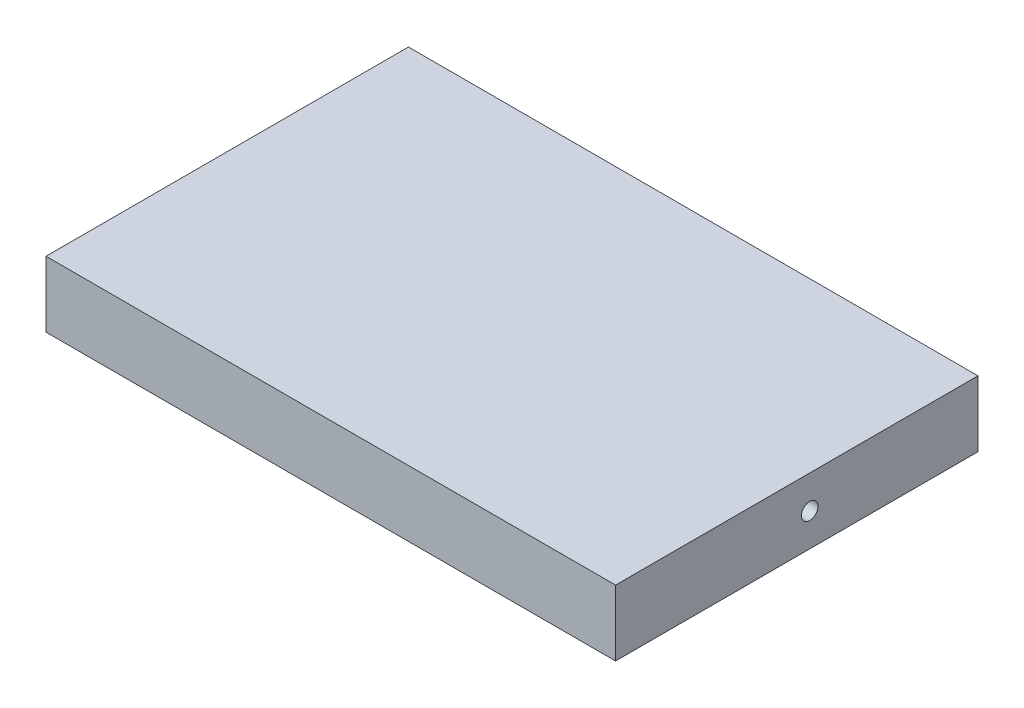
ISO-10303-21;
HEADER;
FILE_DESCRIPTION(('STEP AP214'),'2;1');
FILE_NAME('part.step','',(''),(''),'','','');
FILE_SCHEMA(('AUTOMOTIVE_DESIGN { 1 0 10303 214 1 1 1 1 }'));
ENDSEC;
DATA;
#1=APPLICATION_CONTEXT('core data for automotive mechanical design processes');
#2=APPLICATION_PROTOCOL_DEFINITION('international standard','automotive_design',2000,#1);
#3=PRODUCT_CONTEXT('',#1,'mechanical');
#4=PRODUCT('Part','Part','',(#3));
#5=PRODUCT_RELATED_PRODUCT_CATEGORY('part','',(#4));
#6=PRODUCT_DEFINITION_FORMATION('','',#4);
#7=PRODUCT_DEFINITION_CONTEXT('part definition',#1,'design');
#8=PRODUCT_DEFINITION('design','',#6,#7);
#9=PRODUCT_DEFINITION_SHAPE('','',#8);
#10=(LENGTH_UNIT() NAMED_UNIT(*) SI_UNIT(.MILLI.,.METRE.));
#11=(NAMED_UNIT(*) PLANE_ANGLE_UNIT() SI_UNIT($,.RADIAN.));
#12=(NAMED_UNIT(*) SI_UNIT($,.STERADIAN.) SOLID_ANGLE_UNIT());
#13=UNCERTAINTY_MEASURE_WITH_UNIT(LENGTH_MEASURE(1.E-05),#10,'distance_accuracy_value','');
#14=(GEOMETRIC_REPRESENTATION_CONTEXT(3) GLOBAL_UNCERTAINTY_ASSIGNED_CONTEXT((#13)) GLOBAL_UNIT_ASSIGNED_CONTEXT((#10,
#11,#12)) REPRESENTATION_CONTEXT('',''));
#15=CARTESIAN_POINT('',(0.,0.,0.));
#16=DIRECTION('',(0.,0.,1.));
#17=DIRECTION('',(1.,0.,0.));
#18=AXIS2_PLACEMENT_3D('',#15,#16,#17);
#19=CARTESIAN_POINT('',(110.,25.4,-70.));
#20=DIRECTION('',(-1.,0.,0.));
#21=DIRECTION('',(0.,0.,1.));
#22=AXIS2_PLACEMENT_3D('',#19,#20,#21);
#23=PLANE('',#22);
#24=CARTESIAN_POINT('',(110.,12.7,-5.));
#25=DIRECTION('',(1.,0.,0.));
#26=DIRECTION('',(0.,0.,-1.));
#27=AXIS2_PLACEMENT_3D('',#24,#25,#26);
#28=CIRCLE('',#27,3.2);
#29=CARTESIAN_POINT('',(110.,12.7,-8.2));
#30=VERTEX_POINT('',#29);
#31=EDGE_CURVE('E116',#30,#30,#28,.T.);
#32=ORIENTED_EDGE('',*,*,#31,.F.);
#33=EDGE_LOOP('',(#32));
#34=FACE_BOUND('',#33,.T.);
#35=DIRECTION('',(0.,0.,-1.));
#36=VECTOR('',#35,1.);
#37=CARTESIAN_POINT('',(110.,0.,-70.));
#38=LINE('',#37,#36);
#39=CARTESIAN_POINT('',(110.,0.,70.));
#40=VERTEX_POINT('',#39);
#41=CARTESIAN_POINT('',(110.,0.,-70.));
#42=VERTEX_POINT('',#41);
#43=EDGE_CURVE('E96',#40,#42,#38,.T.);
#44=ORIENTED_EDGE('',*,*,#43,.T.);
#45=DIRECTION('',(0.,-1.,0.));
#46=VECTOR('',#45,1.);
#47=CARTESIAN_POINT('',(110.,25.4,-70.));
#48=LINE('',#47,#46);
#49=CARTESIAN_POINT('',(110.,25.4,-70.));
#50=VERTEX_POINT('',#49);
#51=EDGE_CURVE('E11',#50,#42,#48,.T.);
#52=ORIENTED_EDGE('',*,*,#51,.F.);
#53=DIRECTION('',(0.,0.,-1.));
#54=VECTOR('',#53,1.);
#55=CARTESIAN_POINT('',(110.,25.4,-70.));
#56=LINE('',#55,#54);
#57=CARTESIAN_POINT('',(110.,25.4,70.));
#58=VERTEX_POINT('',#57);
#59=EDGE_CURVE('E84',#58,#50,#56,.T.);
#60=ORIENTED_EDGE('',*,*,#59,.F.);
#61=DIRECTION('',(0.,-1.,0.));
#62=VECTOR('',#61,1.);
#63=CARTESIAN_POINT('',(110.,25.4,70.));
#64=LINE('',#63,#62);
#65=EDGE_CURVE('E92',#58,#40,#64,.T.);
#66=ORIENTED_EDGE('',*,*,#65,.T.);
#67=EDGE_LOOP('',(#44,#52,#60,#66));
#68=FACE_BOUND('',#67,.T.);
#69=ADVANCED_FACE('F33',(#34,#68),#23,.F.);
#70=CARTESIAN_POINT('',(-110.,25.4,-70.));
#71=DIRECTION('',(0.,0.,1.));
#72=DIRECTION('',(1.,0.,0.));
#73=AXIS2_PLACEMENT_3D('',#70,#71,#72);
#74=PLANE('',#73);
#75=DIRECTION('',(-1.,0.,0.));
#76=VECTOR('',#75,1.);
#77=CARTESIAN_POINT('',(-110.,0.,-70.));
#78=LINE('',#77,#76);
#79=CARTESIAN_POINT('',(-110.,0.,-70.));
#80=VERTEX_POINT('',#79);
#81=EDGE_CURVE('E88',#42,#80,#78,.T.);
#82=ORIENTED_EDGE('',*,*,#81,.T.);
#83=DIRECTION('',(0.,-1.,0.));
#84=VECTOR('',#83,1.);
#85=CARTESIAN_POINT('',(-110.,25.4,-70.));
#86=LINE('',#85,#84);
#87=CARTESIAN_POINT('',(-110.,25.4,-70.));
#88=VERTEX_POINT('',#87);
#89=EDGE_CURVE('E41',#88,#80,#86,.T.);
#90=ORIENTED_EDGE('',*,*,#89,.F.);
#91=DIRECTION('',(-1.,0.,0.));
#92=VECTOR('',#91,1.);
#93=CARTESIAN_POINT('',(-110.,25.4,-70.));
#94=LINE('',#93,#92);
#95=EDGE_CURVE('E79',#50,#88,#94,.T.);
#96=ORIENTED_EDGE('',*,*,#95,.F.);
#97=ORIENTED_EDGE('',*,*,#51,.T.);
#98=EDGE_LOOP('',(#82,#90,#96,#97));
#99=FACE_BOUND('',#98,.T.);
#100=ADVANCED_FACE('F87',(#99),#74,.F.);
#101=CARTESIAN_POINT('',(-110.,25.4,-70.));
#102=DIRECTION('',(1.,0.,0.));
#103=DIRECTION('',(0.,0.,-1.));
#104=AXIS2_PLACEMENT_3D('',#101,#102,#103);
#105=PLANE('',#104);
#106=CARTESIAN_POINT('',(-110.,12.7,-4.99999999999998));
#107=DIRECTION('',(-1.,0.,0.));
#108=DIRECTION('',(0.,0.,1.));
#109=AXIS2_PLACEMENT_3D('',#106,#107,#108);
#110=CIRCLE('',#109,3.2);
#111=CARTESIAN_POINT('',(-110.,12.7,-1.79999999999998));
#112=VERTEX_POINT('',#111);
#113=EDGE_CURVE('E110',#112,#112,#110,.T.);
#114=ORIENTED_EDGE('',*,*,#113,.F.);
#115=EDGE_LOOP('',(#114));
#116=FACE_BOUND('',#115,.T.);
#117=DIRECTION('',(0.,0.,1.));
#118=VECTOR('',#117,1.);
#119=CARTESIAN_POINT('',(-110.,0.,-70.));
#120=LINE('',#119,#118);
#121=CARTESIAN_POINT('',(-110.,0.,70.));
#122=VERTEX_POINT('',#121);
#123=EDGE_CURVE('E66',#80,#122,#120,.T.);
#124=ORIENTED_EDGE('',*,*,#123,.T.);
#125=DIRECTION('',(0.,-1.,0.));
#126=VECTOR('',#125,1.);
#127=CARTESIAN_POINT('',(-110.,25.4,70.));
#128=LINE('',#127,#126);
#129=CARTESIAN_POINT('',(-110.,25.4,70.));
#130=VERTEX_POINT('',#129);
#131=EDGE_CURVE('E89',#130,#122,#128,.T.);
#132=ORIENTED_EDGE('',*,*,#131,.F.);
#133=DIRECTION('',(0.,0.,1.));
#134=VECTOR('',#133,1.);
#135=CARTESIAN_POINT('',(-110.,25.4,-70.));
#136=LINE('',#135,#134);
#137=EDGE_CURVE('E82',#88,#130,#136,.T.);
#138=ORIENTED_EDGE('',*,*,#137,.F.);
#139=ORIENTED_EDGE('',*,*,#89,.T.);
#140=EDGE_LOOP('',(#124,#132,#138,#139));
#141=FACE_BOUND('',#140,.T.);
#142=ADVANCED_FACE('F90',(#116,#141),#105,.F.);
#143=CARTESIAN_POINT('',(-110.,25.4,70.));
#144=DIRECTION('',(0.,0.,-1.));
#145=DIRECTION('',(-1.,0.,0.));
#146=AXIS2_PLACEMENT_3D('',#143,#144,#145);
#147=PLANE('',#146);
#148=DIRECTION('',(1.,0.,0.));
#149=VECTOR('',#148,1.);
#150=CARTESIAN_POINT('',(-110.,0.,70.));
#151=LINE('',#150,#149);
#152=EDGE_CURVE('E72',#122,#40,#151,.T.);
#153=ORIENTED_EDGE('',*,*,#152,.T.);
#154=ORIENTED_EDGE('',*,*,#65,.F.);
#155=DIRECTION('',(1.,0.,0.));
#156=VECTOR('',#155,1.);
#157=CARTESIAN_POINT('',(-110.,25.4,70.));
#158=LINE('',#157,#156);
#159=EDGE_CURVE('E49',#130,#58,#158,.T.);
#160=ORIENTED_EDGE('',*,*,#159,.F.);
#161=ORIENTED_EDGE('',*,*,#131,.T.);
#162=EDGE_LOOP('',(#153,#154,#160,#161));
#163=FACE_BOUND('',#162,.T.);
#164=ADVANCED_FACE('F104',(#163),#147,.F.);
#165=CARTESIAN_POINT('',(0.,25.4,0.));
#166=DIRECTION('',(0.,1.,0.));
#167=DIRECTION('',(0.,0.,1.));
#168=AXIS2_PLACEMENT_3D('',#165,#166,#167);
#169=PLANE('',#168);
#170=ORIENTED_EDGE('',*,*,#59,.T.);
#171=ORIENTED_EDGE('',*,*,#95,.T.);
#172=ORIENTED_EDGE('',*,*,#137,.T.);
#173=ORIENTED_EDGE('',*,*,#159,.T.);
#174=EDGE_LOOP('',(#170,#171,#172,#173));
#175=FACE_BOUND('',#174,.T.);
#176=ADVANCED_FACE('F80',(#175),#169,.T.);
#177=CARTESIAN_POINT('',(0.,0.,0.));
#178=DIRECTION('',(0.,1.,0.));
#179=DIRECTION('',(0.,0.,1.));
#180=AXIS2_PLACEMENT_3D('',#177,#178,#179);
#181=PLANE('',#180);
#182=ORIENTED_EDGE('',*,*,#43,.F.);
#183=ORIENTED_EDGE('',*,*,#152,.F.);
#184=ORIENTED_EDGE('',*,*,#123,.F.);
#185=ORIENTED_EDGE('',*,*,#81,.F.);
#186=EDGE_LOOP('',(#182,#183,#184,#185));
#187=FACE_BOUND('',#186,.T.);
#188=ADVANCED_FACE('F107',(#187),#181,.F.);
#189=CARTESIAN_POINT('',(-90.,12.7,-4.99999999999999));
#190=DIRECTION('',(-1.,0.,0.));
#191=DIRECTION('',(0.,0.,1.));
#192=AXIS2_PLACEMENT_3D('',#189,#190,#191);
#193=CYLINDRICAL_SURFACE('',#192,3.2);
#194=CARTESIAN_POINT('',(-90.,12.7,-4.99999999999999));
#195=DIRECTION('',(-1.,0.,0.));
#196=DIRECTION('',(0.,0.,1.));
#197=AXIS2_PLACEMENT_3D('',#194,#195,#196);
#198=CIRCLE('',#197,3.2);
#199=CARTESIAN_POINT('',(-90.,12.7,-1.79999999999999));
#200=VERTEX_POINT('',#199);
#201=EDGE_CURVE('E99',#200,#200,#198,.T.);
#202=ORIENTED_EDGE('',*,*,#201,.F.);
#203=EDGE_LOOP('',(#202));
#204=FACE_BOUND('',#203,.T.);
#205=ORIENTED_EDGE('',*,*,#113,.T.);
#206=EDGE_LOOP('',(#205));
#207=FACE_BOUND('',#206,.T.);
#208=ADVANCED_FACE('F145',(#204,#207),#193,.F.);
#209=CARTESIAN_POINT('',(-90.,12.7,-4.99999999999999));
#210=DIRECTION('',(-1.,0.,0.));
#211=DIRECTION('',(0.,0.,1.));
#212=AXIS2_PLACEMENT_3D('',#209,#210,#211);
#213=PLANE('',#212);
#214=ORIENTED_EDGE('',*,*,#201,.T.);
#215=EDGE_LOOP('',(#214));
#216=FACE_BOUND('',#215,.T.);
#217=ADVANCED_FACE('F127',(#216),#213,.T.);
#218=CARTESIAN_POINT('',(90.,12.7,-4.99999999999999));
#219=DIRECTION('',(1.,0.,0.));
#220=DIRECTION('',(0.,0.,-1.));
#221=AXIS2_PLACEMENT_3D('',#218,#219,#220);
#222=CYLINDRICAL_SURFACE('',#221,3.2);
#223=CARTESIAN_POINT('',(90.,12.7,-4.99999999999999));
#224=DIRECTION('',(1.,0.,0.));
#225=DIRECTION('',(0.,0.,-1.));
#226=AXIS2_PLACEMENT_3D('',#223,#224,#225);
#227=CIRCLE('',#226,3.2);
#228=CARTESIAN_POINT('',(90.,12.7,-8.19999999999999));
#229=VERTEX_POINT('',#228);
#230=EDGE_CURVE('E113',#229,#229,#227,.T.);
#231=ORIENTED_EDGE('',*,*,#230,.F.);
#232=EDGE_LOOP('',(#231));
#233=FACE_BOUND('',#232,.T.);
#234=ORIENTED_EDGE('',*,*,#31,.T.);
#235=EDGE_LOOP('',(#234));
#236=FACE_BOUND('',#235,.T.);
#237=ADVANCED_FACE('F124',(#233,#236),#222,.F.);
#238=CARTESIAN_POINT('',(90.,12.7,-4.99999999999999));
#239=DIRECTION('',(1.,0.,0.));
#240=DIRECTION('',(0.,0.,-1.));
#241=AXIS2_PLACEMENT_3D('',#238,#239,#240);
#242=PLANE('',#241);
#243=ORIENTED_EDGE('',*,*,#230,.T.);
#244=EDGE_LOOP('',(#243));
#245=FACE_BOUND('',#244,.T.);
#246=ADVANCED_FACE('F122',(#245),#242,.T.);
#247=CLOSED_SHELL('',(#69,#100,#142,#164,#176,#188,#208,#217,#237,#246));
#248=MANIFOLD_SOLID_BREP('B2',#247);
#249=ADVANCED_BREP_SHAPE_REPRESENTATION('',(#18,#248),#14);
#250=SHAPE_DEFINITION_REPRESENTATION(#9,#249);
ENDSEC;
END-ISO-10303-21;
